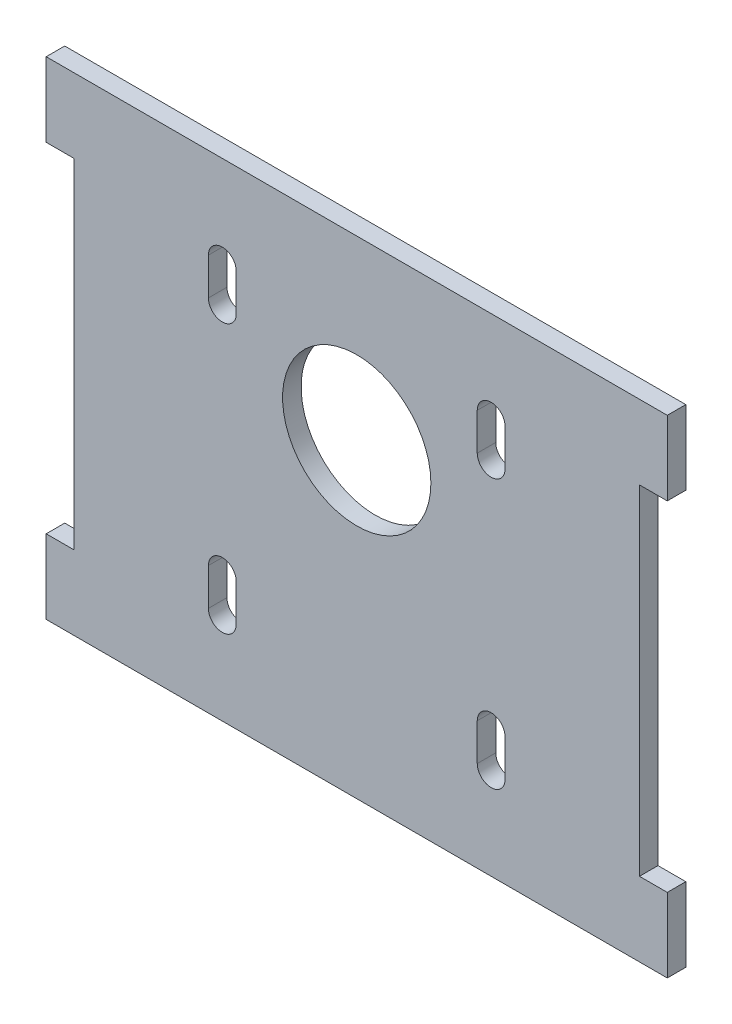
ISO-10303-21;
HEADER;
FILE_DESCRIPTION(('STEP AP214'),'2;1');
FILE_NAME('part.step','',(''),(''),'','','');
FILE_SCHEMA(('AUTOMOTIVE_DESIGN { 1 0 10303 214 1 1 1 1 }'));
ENDSEC;
DATA;
#1=APPLICATION_CONTEXT('core data for automotive mechanical design processes');
#2=APPLICATION_PROTOCOL_DEFINITION('international standard','automotive_design',2000,#1);
#3=PRODUCT_CONTEXT('',#1,'mechanical');
#4=PRODUCT('Part','Part','',(#3));
#5=PRODUCT_RELATED_PRODUCT_CATEGORY('part','',(#4));
#6=PRODUCT_DEFINITION_FORMATION('','',#4);
#7=PRODUCT_DEFINITION_CONTEXT('part definition',#1,'design');
#8=PRODUCT_DEFINITION('design','',#6,#7);
#9=PRODUCT_DEFINITION_SHAPE('','',#8);
#10=(LENGTH_UNIT() NAMED_UNIT(*) SI_UNIT(.MILLI.,.METRE.));
#11=(NAMED_UNIT(*) PLANE_ANGLE_UNIT() SI_UNIT($,.RADIAN.));
#12=(NAMED_UNIT(*) SI_UNIT($,.STERADIAN.) SOLID_ANGLE_UNIT());
#13=UNCERTAINTY_MEASURE_WITH_UNIT(LENGTH_MEASURE(1.E-05),#10,'distance_accuracy_value','');
#14=(GEOMETRIC_REPRESENTATION_CONTEXT(3) GLOBAL_UNCERTAINTY_ASSIGNED_CONTEXT((#13)) GLOBAL_UNIT_ASSIGNED_CONTEXT((#10,
#11,#12)) REPRESENTATION_CONTEXT('',''));
#15=CARTESIAN_POINT('',(0.,0.,0.));
#16=DIRECTION('',(0.,0.,1.));
#17=DIRECTION('',(1.,0.,0.));
#18=AXIS2_PLACEMENT_3D('',#15,#16,#17);
#19=CARTESIAN_POINT('',(106.3625,60.5945834611221,6.35));
#20=DIRECTION('',(-1.,0.,0.));
#21=DIRECTION('',(0.,-1.,0.));
#22=AXIS2_PLACEMENT_3D('',#19,#20,#21);
#23=PLANE('',#22);
#24=DIRECTION('',(0.,1.,0.));
#25=VECTOR('',#24,1.);
#26=CARTESIAN_POINT('',(106.3625,60.5945834611221,0.));
#27=LINE('',#26,#25);
#28=CARTESIAN_POINT('',(106.3625,-106.314583461122,0.));
#29=VERTEX_POINT('',#28);
#30=CARTESIAN_POINT('',(106.3625,-80.9145834611216,0.));
#31=VERTEX_POINT('',#30);
#32=EDGE_CURVE('E239',#29,#31,#27,.T.);
#33=ORIENTED_EDGE('',*,*,#32,.T.);
#34=DIRECTION('',(0.,0.,1.));
#35=VECTOR('',#34,1.);
#36=CARTESIAN_POINT('',(106.3625,-80.9145834611216,-0.00100000000000013));
#37=LINE('',#36,#35);
#38=CARTESIAN_POINT('',(106.3625,-80.9145834611216,6.35));
#39=VERTEX_POINT('',#38);
#40=EDGE_CURVE('E224',#31,#39,#37,.T.);
#41=ORIENTED_EDGE('',*,*,#40,.T.);
#42=DIRECTION('',(0.,1.,0.));
#43=VECTOR('',#42,1.);
#44=CARTESIAN_POINT('',(106.3625,60.5945834611221,6.35));
#45=LINE('',#44,#43);
#46=CARTESIAN_POINT('',(106.3625,-106.314583461122,6.35));
#47=VERTEX_POINT('',#46);
#48=EDGE_CURVE('E261',#47,#39,#45,.T.);
#49=ORIENTED_EDGE('',*,*,#48,.F.);
#50=DIRECTION('',(0.,0.,-1.));
#51=VECTOR('',#50,1.);
#52=CARTESIAN_POINT('',(106.3625,-106.314583461122,6.35));
#53=LINE('',#52,#51);
#54=EDGE_CURVE('E39',#47,#29,#53,.T.);
#55=ORIENTED_EDGE('',*,*,#54,.T.);
#56=EDGE_LOOP('',(#33,#41,#49,#55));
#57=FACE_BOUND('',#56,.T.);
#58=ADVANCED_FACE('F31',(#57),#23,.F.);
#59=CARTESIAN_POINT('',(-106.3625,60.5945834611221,6.35));
#60=DIRECTION('',(1.,0.,0.));
#61=DIRECTION('',(0.,1.,0.));
#62=AXIS2_PLACEMENT_3D('',#59,#60,#61);
#63=PLANE('',#62);
#64=DIRECTION('',(0.,-1.,0.));
#65=VECTOR('',#64,1.);
#66=CARTESIAN_POINT('',(-106.3625,60.5945834611221,0.));
#67=LINE('',#66,#65);
#68=CARTESIAN_POINT('',(-106.3625,60.5945834611221,0.));
#69=VERTEX_POINT('',#68);
#70=CARTESIAN_POINT('',(-106.3625,35.1945834611221,0.));
#71=VERTEX_POINT('',#70);
#72=EDGE_CURVE('E243',#69,#71,#67,.T.);
#73=ORIENTED_EDGE('',*,*,#72,.T.);
#74=DIRECTION('',(0.,0.,1.));
#75=VECTOR('',#74,1.);
#76=CARTESIAN_POINT('',(-106.3625,35.1945834611221,-0.00100000000000013));
#77=LINE('',#76,#75);
#78=CARTESIAN_POINT('',(-106.3625,35.1945834611221,6.35));
#79=VERTEX_POINT('',#78);
#80=EDGE_CURVE('E296',#71,#79,#77,.T.);
#81=ORIENTED_EDGE('',*,*,#80,.T.);
#82=DIRECTION('',(0.,-1.,0.));
#83=VECTOR('',#82,1.);
#84=CARTESIAN_POINT('',(-106.3625,60.5945834611221,6.35));
#85=LINE('',#84,#83);
#86=CARTESIAN_POINT('',(-106.3625,60.5945834611221,6.35));
#87=VERTEX_POINT('',#86);
#88=EDGE_CURVE('E437',#87,#79,#85,.T.);
#89=ORIENTED_EDGE('',*,*,#88,.F.);
#90=DIRECTION('',(0.,0.,-1.));
#91=VECTOR('',#90,1.);
#92=CARTESIAN_POINT('',(-106.3625,60.5945834611221,6.35));
#93=LINE('',#92,#91);
#94=EDGE_CURVE('E249',#87,#69,#93,.T.);
#95=ORIENTED_EDGE('',*,*,#94,.T.);
#96=EDGE_LOOP('',(#73,#81,#89,#95));
#97=FACE_BOUND('',#96,.T.);
#98=ADVANCED_FACE('F464',(#97),#63,.F.);
#99=CARTESIAN_POINT('',(-106.3625,-80.9145834611216,6.35));
#100=VERTEX_POINT('',#99);
#101=CARTESIAN_POINT('',(-106.3625,-106.314583461122,6.35));
#102=VERTEX_POINT('',#101);
#103=EDGE_CURVE('E248',#100,#102,#85,.T.);
#104=ORIENTED_EDGE('',*,*,#103,.F.);
#105=DIRECTION('',(0.,0.,1.));
#106=VECTOR('',#105,1.);
#107=CARTESIAN_POINT('',(-106.3625,-80.9145834611216,-0.00100000000000013));
#108=LINE('',#107,#106);
#109=CARTESIAN_POINT('',(-106.3625,-80.9145834611216,0.));
#110=VERTEX_POINT('',#109);
#111=EDGE_CURVE('E295',#110,#100,#108,.T.);
#112=ORIENTED_EDGE('',*,*,#111,.F.);
#113=CARTESIAN_POINT('',(-106.3625,-106.314583461122,0.));
#114=VERTEX_POINT('',#113);
#115=EDGE_CURVE('E436',#110,#114,#67,.T.);
#116=ORIENTED_EDGE('',*,*,#115,.T.);
#117=DIRECTION('',(0.,0.,-1.));
#118=VECTOR('',#117,1.);
#119=CARTESIAN_POINT('',(-106.3625,-106.314583461122,6.35));
#120=LINE('',#119,#118);
#121=EDGE_CURVE('E11',#102,#114,#120,.T.);
#122=ORIENTED_EDGE('',*,*,#121,.F.);
#123=EDGE_LOOP('',(#104,#112,#116,#122));
#124=FACE_BOUND('',#123,.T.);
#125=ADVANCED_FACE('F33',(#124),#63,.F.);
#126=CARTESIAN_POINT('',(-106.3625,-106.314583461122,6.35));
#127=DIRECTION('',(0.,1.,0.));
#128=DIRECTION('',(0.,0.,1.));
#129=AXIS2_PLACEMENT_3D('',#126,#127,#128);
#130=PLANE('',#129);
#131=DIRECTION('',(1.,0.,0.));
#132=VECTOR('',#131,1.);
#133=CARTESIAN_POINT('',(-106.3625,-106.314583461122,0.));
#134=LINE('',#133,#132);
#135=EDGE_CURVE('E240',#114,#29,#134,.T.);
#136=ORIENTED_EDGE('',*,*,#135,.T.);
#137=ORIENTED_EDGE('',*,*,#54,.F.);
#138=DIRECTION('',(1.,0.,0.));
#139=VECTOR('',#138,1.);
#140=CARTESIAN_POINT('',(-106.3625,-106.314583461122,6.35));
#141=LINE('',#140,#139);
#142=EDGE_CURVE('E440',#102,#47,#141,.T.);
#143=ORIENTED_EDGE('',*,*,#142,.F.);
#144=ORIENTED_EDGE('',*,*,#121,.T.);
#145=EDGE_LOOP('',(#136,#137,#143,#144));
#146=FACE_BOUND('',#145,.T.);
#147=ADVANCED_FACE('F472',(#146),#130,.F.);
#148=CARTESIAN_POINT('',(106.3625,35.1945834611221,6.35));
#149=VERTEX_POINT('',#148);
#150=CARTESIAN_POINT('',(106.3625,60.5945834611221,6.35));
#151=VERTEX_POINT('',#150);
#152=EDGE_CURVE('E232',#149,#151,#45,.T.);
#153=ORIENTED_EDGE('',*,*,#152,.F.);
#154=DIRECTION('',(0.,0.,1.));
#155=VECTOR('',#154,1.);
#156=CARTESIAN_POINT('',(106.3625,35.1945834611221,-0.00100000000000013));
#157=LINE('',#156,#155);
#158=CARTESIAN_POINT('',(106.3625,35.1945834611221,0.));
#159=VERTEX_POINT('',#158);
#160=EDGE_CURVE('E219',#159,#149,#157,.T.);
#161=ORIENTED_EDGE('',*,*,#160,.F.);
#162=CARTESIAN_POINT('',(106.3625,60.5945834611221,0.));
#163=VERTEX_POINT('',#162);
#164=EDGE_CURVE('E230',#159,#163,#27,.T.);
#165=ORIENTED_EDGE('',*,*,#164,.T.);
#166=DIRECTION('',(0.,0.,-1.));
#167=VECTOR('',#166,1.);
#168=CARTESIAN_POINT('',(106.3625,60.5945834611221,6.35));
#169=LINE('',#168,#167);
#170=EDGE_CURVE('E252',#151,#163,#169,.T.);
#171=ORIENTED_EDGE('',*,*,#170,.F.);
#172=EDGE_LOOP('',(#153,#161,#165,#171));
#173=FACE_BOUND('',#172,.T.);
#174=ADVANCED_FACE('F228',(#173),#23,.F.);
#175=CARTESIAN_POINT('',(-106.3625,60.5945834611221,6.35));
#176=DIRECTION('',(0.,-1.,0.));
#177=DIRECTION('',(0.,0.,-1.));
#178=AXIS2_PLACEMENT_3D('',#175,#176,#177);
#179=PLANE('',#178);
#180=DIRECTION('',(-1.,0.,0.));
#181=VECTOR('',#180,1.);
#182=CARTESIAN_POINT('',(-106.3625,60.5945834611221,0.));
#183=LINE('',#182,#181);
#184=EDGE_CURVE('E238',#163,#69,#183,.T.);
#185=ORIENTED_EDGE('',*,*,#184,.T.);
#186=ORIENTED_EDGE('',*,*,#94,.F.);
#187=DIRECTION('',(-1.,0.,0.));
#188=VECTOR('',#187,1.);
#189=CARTESIAN_POINT('',(-106.3625,60.5945834611221,6.35));
#190=LINE('',#189,#188);
#191=EDGE_CURVE('E253',#151,#87,#190,.T.);
#192=ORIENTED_EDGE('',*,*,#191,.F.);
#193=ORIENTED_EDGE('',*,*,#170,.T.);
#194=EDGE_LOOP('',(#185,#186,#192,#193));
#195=FACE_BOUND('',#194,.T.);
#196=ADVANCED_FACE('F468',(#195),#179,.F.);
#197=CARTESIAN_POINT('',(-106.3625,-106.314583461122,6.35));
#198=DIRECTION('',(0.,0.,1.));
#199=DIRECTION('',(1.,0.,0.));
#200=AXIS2_PLACEMENT_3D('',#197,#198,#199);
#201=PLANE('',#200);
#202=DIRECTION('',(1.,0.,0.));
#203=VECTOR('',#202,1.);
#204=CARTESIAN_POINT('',(106.3625,-80.9145834611216,6.35));
#205=LINE('',#204,#203);
#206=CARTESIAN_POINT('',(96.8375,-80.9145834611216,6.35));
#207=VERTEX_POINT('',#206);
#208=EDGE_CURVE('E233',#207,#39,#205,.T.);
#209=ORIENTED_EDGE('',*,*,#208,.F.);
#210=DIRECTION('',(0.,-1.,0.));
#211=VECTOR('',#210,1.);
#212=CARTESIAN_POINT('',(96.8375,-80.9145834611216,6.35));
#213=LINE('',#212,#211);
#214=CARTESIAN_POINT('',(96.8375,35.1945834611221,6.35));
#215=VERTEX_POINT('',#214);
#216=EDGE_CURVE('E272',#215,#207,#213,.T.);
#217=ORIENTED_EDGE('',*,*,#216,.F.);
#218=DIRECTION('',(-1.,0.,0.));
#219=VECTOR('',#218,1.);
#220=CARTESIAN_POINT('',(106.3625,35.1945834611221,6.35));
#221=LINE('',#220,#219);
#222=EDGE_CURVE('E270',#149,#215,#221,.T.);
#223=ORIENTED_EDGE('',*,*,#222,.F.);
#224=ORIENTED_EDGE('',*,*,#152,.T.);
#225=ORIENTED_EDGE('',*,*,#191,.T.);
#226=ORIENTED_EDGE('',*,*,#88,.T.);
#227=DIRECTION('',(-1.,0.,0.));
#228=VECTOR('',#227,1.);
#229=CARTESIAN_POINT('',(-106.3625,35.1945834611221,6.35));
#230=LINE('',#229,#228);
#231=CARTESIAN_POINT('',(-96.8375,35.1945834611221,6.35));
#232=VERTEX_POINT('',#231);
#233=EDGE_CURVE('E293',#232,#79,#230,.T.);
#234=ORIENTED_EDGE('',*,*,#233,.F.);
#235=DIRECTION('',(0.,1.,0.));
#236=VECTOR('',#235,1.);
#237=CARTESIAN_POINT('',(-96.8375,-80.9145834611216,6.35));
#238=LINE('',#237,#236);
#239=CARTESIAN_POINT('',(-96.8375,-80.9145834611216,6.35));
#240=VERTEX_POINT('',#239);
#241=EDGE_CURVE('E290',#240,#232,#238,.T.);
#242=ORIENTED_EDGE('',*,*,#241,.F.);
#243=DIRECTION('',(1.,0.,0.));
#244=VECTOR('',#243,1.);
#245=CARTESIAN_POINT('',(-106.3625,-80.9145834611216,6.35));
#246=LINE('',#245,#244);
#247=EDGE_CURVE('E287',#100,#240,#246,.T.);
#248=ORIENTED_EDGE('',*,*,#247,.F.);
#249=ORIENTED_EDGE('',*,*,#103,.T.);
#250=ORIENTED_EDGE('',*,*,#142,.T.);
#251=ORIENTED_EDGE('',*,*,#48,.T.);
#252=EDGE_LOOP('',(#209,#217,#223,#224,#225,#226,#234,#242,#248,#249,#250,#251));
#253=FACE_BOUND('',#252,.T.);
#254=CARTESIAN_POINT('',(0.,0.,6.35));
#255=DIRECTION('',(0.,0.,1.));
#256=DIRECTION('',(1.,0.,0.));
#257=AXIS2_PLACEMENT_3D('',#254,#255,#256);
#258=CIRCLE('',#257,25.4);
#259=CARTESIAN_POINT('',(25.4,0.,6.35));
#260=VERTEX_POINT('',#259);
#261=EDGE_CURVE('E306',#260,#260,#258,.T.);
#262=ORIENTED_EDGE('',*,*,#261,.F.);
#263=EDGE_LOOP('',(#262));
#264=FACE_BOUND('',#263,.T.);
#265=CARTESIAN_POINT('',(-46.0375,-75.2475,6.35));
#266=DIRECTION('',(0.,0.,1.));
#267=DIRECTION('',(-1.,0.,0.));
#268=AXIS2_PLACEMENT_3D('',#265,#266,#267);
#269=CIRCLE('',#268,4.7625);
#270=CARTESIAN_POINT('',(-50.8,-75.2475,6.35));
#271=VERTEX_POINT('',#270);
#272=CARTESIAN_POINT('',(-41.275,-75.2475,6.35));
#273=VERTEX_POINT('',#272);
#274=EDGE_CURVE('E320',#271,#273,#269,.T.);
#275=ORIENTED_EDGE('',*,*,#274,.F.);
#276=DIRECTION('',(0.,-1.,0.));
#277=VECTOR('',#276,1.);
#278=CARTESIAN_POINT('',(-50.8,-75.2475,6.35));
#279=LINE('',#278,#277);
#280=CARTESIAN_POINT('',(-50.8,-62.5475,6.35));
#281=VERTEX_POINT('',#280);
#282=EDGE_CURVE('E328',#281,#271,#279,.T.);
#283=ORIENTED_EDGE('',*,*,#282,.F.);
#284=CARTESIAN_POINT('',(-46.0375,-62.5475,6.35));
#285=DIRECTION('',(0.,0.,1.));
#286=DIRECTION('',(-1.,0.,0.));
#287=AXIS2_PLACEMENT_3D('',#284,#285,#286);
#288=CIRCLE('',#287,4.7625);
#289=CARTESIAN_POINT('',(-41.275,-62.5475,6.35));
#290=VERTEX_POINT('',#289);
#291=EDGE_CURVE('E325',#290,#281,#288,.T.);
#292=ORIENTED_EDGE('',*,*,#291,.F.);
#293=DIRECTION('',(0.,1.,0.));
#294=VECTOR('',#293,1.);
#295=CARTESIAN_POINT('',(-41.275,-75.2475,6.35));
#296=LINE('',#295,#294);
#297=EDGE_CURVE('E322',#273,#290,#296,.T.);
#298=ORIENTED_EDGE('',*,*,#297,.F.);
#299=EDGE_LOOP('',(#275,#283,#292,#298));
#300=FACE_BOUND('',#299,.T.);
#301=CARTESIAN_POINT('',(-46.0375,16.8275,6.35));
#302=DIRECTION('',(0.,0.,1.));
#303=DIRECTION('',(-1.,0.,0.));
#304=AXIS2_PLACEMENT_3D('',#301,#302,#303);
#305=CIRCLE('',#304,4.7625);
#306=CARTESIAN_POINT('',(-50.8,16.8275,6.35));
#307=VERTEX_POINT('',#306);
#308=CARTESIAN_POINT('',(-41.275,16.8275,6.35));
#309=VERTEX_POINT('',#308);
#310=EDGE_CURVE('E351',#307,#309,#305,.T.);
#311=ORIENTED_EDGE('',*,*,#310,.F.);
#312=DIRECTION('',(0.,-1.,0.));
#313=VECTOR('',#312,1.);
#314=CARTESIAN_POINT('',(-50.8,16.8275,6.35));
#315=LINE('',#314,#313);
#316=CARTESIAN_POINT('',(-50.8,29.5275,6.35));
#317=VERTEX_POINT('',#316);
#318=EDGE_CURVE('E359',#317,#307,#315,.T.);
#319=ORIENTED_EDGE('',*,*,#318,.F.);
#320=CARTESIAN_POINT('',(-46.0375,29.5275,6.35));
#321=DIRECTION('',(0.,0.,1.));
#322=DIRECTION('',(-1.,0.,0.));
#323=AXIS2_PLACEMENT_3D('',#320,#321,#322);
#324=CIRCLE('',#323,4.7625);
#325=CARTESIAN_POINT('',(-41.275,29.5275,6.35));
#326=VERTEX_POINT('',#325);
#327=EDGE_CURVE('E356',#326,#317,#324,.T.);
#328=ORIENTED_EDGE('',*,*,#327,.F.);
#329=DIRECTION('',(0.,1.,0.));
#330=VECTOR('',#329,1.);
#331=CARTESIAN_POINT('',(-41.275,16.8275,6.35));
#332=LINE('',#331,#330);
#333=EDGE_CURVE('E353',#309,#326,#332,.T.);
#334=ORIENTED_EDGE('',*,*,#333,.F.);
#335=EDGE_LOOP('',(#311,#319,#328,#334));
#336=FACE_BOUND('',#335,.T.);
#337=CARTESIAN_POINT('',(46.0375,16.8275,6.35));
#338=DIRECTION('',(0.,0.,1.));
#339=DIRECTION('',(-1.,0.,0.));
#340=AXIS2_PLACEMENT_3D('',#337,#338,#339);
#341=CIRCLE('',#340,4.7625);
#342=CARTESIAN_POINT('',(41.275,16.8275,6.35));
#343=VERTEX_POINT('',#342);
#344=CARTESIAN_POINT('',(50.8,16.8275,6.35));
#345=VERTEX_POINT('',#344);
#346=EDGE_CURVE('E382',#343,#345,#341,.T.);
#347=ORIENTED_EDGE('',*,*,#346,.F.);
#348=DIRECTION('',(0.,-1.,0.));
#349=VECTOR('',#348,1.);
#350=CARTESIAN_POINT('',(41.275,16.8275,6.35));
#351=LINE('',#350,#349);
#352=CARTESIAN_POINT('',(41.275,29.5275,6.35));
#353=VERTEX_POINT('',#352);
#354=EDGE_CURVE('E390',#353,#343,#351,.T.);
#355=ORIENTED_EDGE('',*,*,#354,.F.);
#356=CARTESIAN_POINT('',(46.0375,29.5275,6.35));
#357=DIRECTION('',(0.,0.,1.));
#358=DIRECTION('',(-1.,0.,0.));
#359=AXIS2_PLACEMENT_3D('',#356,#357,#358);
#360=CIRCLE('',#359,4.7625);
#361=CARTESIAN_POINT('',(50.8,29.5275,6.35));
#362=VERTEX_POINT('',#361);
#363=EDGE_CURVE('E387',#362,#353,#360,.T.);
#364=ORIENTED_EDGE('',*,*,#363,.F.);
#365=DIRECTION('',(0.,1.,0.));
#366=VECTOR('',#365,1.);
#367=CARTESIAN_POINT('',(50.8,16.8275,6.35));
#368=LINE('',#367,#366);
#369=EDGE_CURVE('E384',#345,#362,#368,.T.);
#370=ORIENTED_EDGE('',*,*,#369,.F.);
#371=EDGE_LOOP('',(#347,#355,#364,#370));
#372=FACE_BOUND('',#371,.T.);
#373=CARTESIAN_POINT('',(46.0375,-75.2475,6.35));
#374=DIRECTION('',(0.,0.,1.));
#375=DIRECTION('',(-1.,0.,0.));
#376=AXIS2_PLACEMENT_3D('',#373,#374,#375);
#377=CIRCLE('',#376,4.7625);
#378=CARTESIAN_POINT('',(41.275,-75.2475,6.35));
#379=VERTEX_POINT('',#378);
#380=CARTESIAN_POINT('',(50.8,-75.2475,6.35));
#381=VERTEX_POINT('',#380);
#382=EDGE_CURVE('E413',#379,#381,#377,.T.);
#383=ORIENTED_EDGE('',*,*,#382,.F.);
#384=DIRECTION('',(0.,-1.,0.));
#385=VECTOR('',#384,1.);
#386=CARTESIAN_POINT('',(41.275,-75.2475,6.35));
#387=LINE('',#386,#385);
#388=CARTESIAN_POINT('',(41.275,-62.5475,6.35));
#389=VERTEX_POINT('',#388);
#390=EDGE_CURVE('E421',#389,#379,#387,.T.);
#391=ORIENTED_EDGE('',*,*,#390,.F.);
#392=CARTESIAN_POINT('',(46.0375,-62.5475,6.35));
#393=DIRECTION('',(0.,0.,1.));
#394=DIRECTION('',(-1.,0.,0.));
#395=AXIS2_PLACEMENT_3D('',#392,#393,#394);
#396=CIRCLE('',#395,4.7625);
#397=CARTESIAN_POINT('',(50.8,-62.5475,6.35));
#398=VERTEX_POINT('',#397);
#399=EDGE_CURVE('E418',#398,#389,#396,.T.);
#400=ORIENTED_EDGE('',*,*,#399,.F.);
#401=DIRECTION('',(0.,1.,0.));
#402=VECTOR('',#401,1.);
#403=CARTESIAN_POINT('',(50.8,-75.2475,6.35));
#404=LINE('',#403,#402);
#405=EDGE_CURVE('E415',#381,#398,#404,.T.);
#406=ORIENTED_EDGE('',*,*,#405,.F.);
#407=EDGE_LOOP('',(#383,#391,#400,#406));
#408=FACE_BOUND('',#407,.T.);
#409=ADVANCED_FACE('F459',(#253,#264,#300,#336,#372,#408),#201,.T.);
#410=CARTESIAN_POINT('',(-106.3625,-106.314583461122,0.));
#411=DIRECTION('',(0.,0.,1.));
#412=DIRECTION('',(1.,0.,0.));
#413=AXIS2_PLACEMENT_3D('',#410,#411,#412);
#414=PLANE('',#413);
#415=CARTESIAN_POINT('',(0.,0.,0.));
#416=DIRECTION('',(0.,0.,1.));
#417=DIRECTION('',(1.,0.,0.));
#418=AXIS2_PLACEMENT_3D('',#415,#416,#417);
#419=CIRCLE('',#418,25.4);
#420=CARTESIAN_POINT('',(25.4,0.,0.));
#421=VERTEX_POINT('',#420);
#422=EDGE_CURVE('E309',#421,#421,#419,.F.);
#423=ORIENTED_EDGE('',*,*,#422,.F.);
#424=EDGE_LOOP('',(#423));
#425=FACE_BOUND('',#424,.T.);
#426=DIRECTION('',(0.,1.,0.));
#427=VECTOR('',#426,1.);
#428=CARTESIAN_POINT('',(-50.8,-75.2475,0.));
#429=LINE('',#428,#427);
#430=CARTESIAN_POINT('',(-50.8,-75.2475,0.));
#431=VERTEX_POINT('',#430);
#432=CARTESIAN_POINT('',(-50.8,-62.5475,0.));
#433=VERTEX_POINT('',#432);
#434=EDGE_CURVE('E314',#431,#433,#429,.T.);
#435=ORIENTED_EDGE('',*,*,#434,.F.);
#436=CARTESIAN_POINT('',(-46.0375,-75.2475,0.));
#437=DIRECTION('',(0.,0.,1.));
#438=DIRECTION('',(1.,0.,0.));
#439=AXIS2_PLACEMENT_3D('',#436,#437,#438);
#440=CIRCLE('',#439,4.7625);
#441=CARTESIAN_POINT('',(-41.275,-75.2475,0.));
#442=VERTEX_POINT('',#441);
#443=EDGE_CURVE('E317',#442,#431,#440,.F.);
#444=ORIENTED_EDGE('',*,*,#443,.F.);
#445=DIRECTION('',(0.,-1.,0.));
#446=VECTOR('',#445,1.);
#447=CARTESIAN_POINT('',(-41.275,-75.2475,0.));
#448=LINE('',#447,#446);
#449=CARTESIAN_POINT('',(-41.275,-62.5475,0.));
#450=VERTEX_POINT('',#449);
#451=EDGE_CURVE('E334',#450,#442,#448,.T.);
#452=ORIENTED_EDGE('',*,*,#451,.F.);
#453=CARTESIAN_POINT('',(-46.0375,-62.5475,0.));
#454=DIRECTION('',(0.,0.,1.));
#455=DIRECTION('',(1.,0.,0.));
#456=AXIS2_PLACEMENT_3D('',#453,#454,#455);
#457=CIRCLE('',#456,4.7625);
#458=EDGE_CURVE('E312',#433,#450,#457,.F.);
#459=ORIENTED_EDGE('',*,*,#458,.F.);
#460=EDGE_LOOP('',(#435,#444,#452,#459));
#461=FACE_BOUND('',#460,.T.);
#462=DIRECTION('',(0.,1.,0.));
#463=VECTOR('',#462,1.);
#464=CARTESIAN_POINT('',(-50.8,16.8275,0.));
#465=LINE('',#464,#463);
#466=CARTESIAN_POINT('',(-50.8,16.8275,0.));
#467=VERTEX_POINT('',#466);
#468=CARTESIAN_POINT('',(-50.8,29.5275,0.));
#469=VERTEX_POINT('',#468);
#470=EDGE_CURVE('E345',#467,#469,#465,.T.);
#471=ORIENTED_EDGE('',*,*,#470,.F.);
#472=CARTESIAN_POINT('',(-46.0375,16.8275,0.));
#473=DIRECTION('',(0.,0.,1.));
#474=DIRECTION('',(1.,0.,0.));
#475=AXIS2_PLACEMENT_3D('',#472,#473,#474);
#476=CIRCLE('',#475,4.7625);
#477=CARTESIAN_POINT('',(-41.275,16.8275,0.));
#478=VERTEX_POINT('',#477);
#479=EDGE_CURVE('E348',#478,#467,#476,.F.);
#480=ORIENTED_EDGE('',*,*,#479,.F.);
#481=DIRECTION('',(0.,-1.,0.));
#482=VECTOR('',#481,1.);
#483=CARTESIAN_POINT('',(-41.275,16.8275,0.));
#484=LINE('',#483,#482);
#485=CARTESIAN_POINT('',(-41.275,29.5275,0.));
#486=VERTEX_POINT('',#485);
#487=EDGE_CURVE('E365',#486,#478,#484,.T.);
#488=ORIENTED_EDGE('',*,*,#487,.F.);
#489=CARTESIAN_POINT('',(-46.0375,29.5275,0.));
#490=DIRECTION('',(0.,0.,1.));
#491=DIRECTION('',(1.,0.,0.));
#492=AXIS2_PLACEMENT_3D('',#489,#490,#491);
#493=CIRCLE('',#492,4.7625);
#494=EDGE_CURVE('E343',#469,#486,#493,.F.);
#495=ORIENTED_EDGE('',*,*,#494,.F.);
#496=EDGE_LOOP('',(#471,#480,#488,#495));
#497=FACE_BOUND('',#496,.T.);
#498=DIRECTION('',(0.,1.,0.));
#499=VECTOR('',#498,1.);
#500=CARTESIAN_POINT('',(41.275,16.8275,0.));
#501=LINE('',#500,#499);
#502=CARTESIAN_POINT('',(41.275,16.8275,0.));
#503=VERTEX_POINT('',#502);
#504=CARTESIAN_POINT('',(41.275,29.5275,0.));
#505=VERTEX_POINT('',#504);
#506=EDGE_CURVE('E376',#503,#505,#501,.T.);
#507=ORIENTED_EDGE('',*,*,#506,.F.);
#508=CARTESIAN_POINT('',(46.0375,16.8275,0.));
#509=DIRECTION('',(0.,0.,1.));
#510=DIRECTION('',(1.,0.,0.));
#511=AXIS2_PLACEMENT_3D('',#508,#509,#510);
#512=CIRCLE('',#511,4.7625);
#513=CARTESIAN_POINT('',(50.8,16.8275,0.));
#514=VERTEX_POINT('',#513);
#515=EDGE_CURVE('E379',#514,#503,#512,.F.);
#516=ORIENTED_EDGE('',*,*,#515,.F.);
#517=DIRECTION('',(0.,-1.,0.));
#518=VECTOR('',#517,1.);
#519=CARTESIAN_POINT('',(50.8,16.8275,0.));
#520=LINE('',#519,#518);
#521=CARTESIAN_POINT('',(50.8,29.5275,0.));
#522=VERTEX_POINT('',#521);
#523=EDGE_CURVE('E396',#522,#514,#520,.T.);
#524=ORIENTED_EDGE('',*,*,#523,.F.);
#525=CARTESIAN_POINT('',(46.0375,29.5275,0.));
#526=DIRECTION('',(0.,0.,1.));
#527=DIRECTION('',(1.,0.,0.));
#528=AXIS2_PLACEMENT_3D('',#525,#526,#527);
#529=CIRCLE('',#528,4.7625);
#530=EDGE_CURVE('E374',#505,#522,#529,.F.);
#531=ORIENTED_EDGE('',*,*,#530,.F.);
#532=EDGE_LOOP('',(#507,#516,#524,#531));
#533=FACE_BOUND('',#532,.T.);
#534=DIRECTION('',(0.,1.,0.));
#535=VECTOR('',#534,1.);
#536=CARTESIAN_POINT('',(41.275,-75.2475,0.));
#537=LINE('',#536,#535);
#538=CARTESIAN_POINT('',(41.275,-75.2475,0.));
#539=VERTEX_POINT('',#538);
#540=CARTESIAN_POINT('',(41.275,-62.5475,0.));
#541=VERTEX_POINT('',#540);
#542=EDGE_CURVE('E407',#539,#541,#537,.T.);
#543=ORIENTED_EDGE('',*,*,#542,.F.);
#544=CARTESIAN_POINT('',(46.0375,-75.2475,0.));
#545=DIRECTION('',(0.,0.,1.));
#546=DIRECTION('',(1.,0.,0.));
#547=AXIS2_PLACEMENT_3D('',#544,#545,#546);
#548=CIRCLE('',#547,4.7625);
#549=CARTESIAN_POINT('',(50.8,-75.2475,0.));
#550=VERTEX_POINT('',#549);
#551=EDGE_CURVE('E410',#550,#539,#548,.F.);
#552=ORIENTED_EDGE('',*,*,#551,.F.);
#553=DIRECTION('',(0.,-1.,0.));
#554=VECTOR('',#553,1.);
#555=CARTESIAN_POINT('',(50.8,-75.2475,0.));
#556=LINE('',#555,#554);
#557=CARTESIAN_POINT('',(50.8,-62.5475,0.));
#558=VERTEX_POINT('',#557);
#559=EDGE_CURVE('E427',#558,#550,#556,.T.);
#560=ORIENTED_EDGE('',*,*,#559,.F.);
#561=CARTESIAN_POINT('',(46.0375,-62.5475,0.));
#562=DIRECTION('',(0.,0.,1.));
#563=DIRECTION('',(1.,0.,0.));
#564=AXIS2_PLACEMENT_3D('',#561,#562,#563);
#565=CIRCLE('',#564,4.7625);
#566=EDGE_CURVE('E405',#541,#558,#565,.F.);
#567=ORIENTED_EDGE('',*,*,#566,.F.);
#568=EDGE_LOOP('',(#543,#552,#560,#567));
#569=FACE_BOUND('',#568,.T.);
#570=DIRECTION('',(0.,1.,0.));
#571=VECTOR('',#570,1.);
#572=CARTESIAN_POINT('',(96.8375,-80.9145834611216,0.));
#573=LINE('',#572,#571);
#574=CARTESIAN_POINT('',(96.8375,-80.9145834611216,0.));
#575=VERTEX_POINT('',#574);
#576=CARTESIAN_POINT('',(96.8375,35.1945834611221,0.));
#577=VERTEX_POINT('',#576);
#578=EDGE_CURVE('E46',#575,#577,#573,.T.);
#579=ORIENTED_EDGE('',*,*,#578,.F.);
#580=DIRECTION('',(-1.,0.,0.));
#581=VECTOR('',#580,1.);
#582=CARTESIAN_POINT('',(106.3625,-80.9145834611216,0.));
#583=LINE('',#582,#581);
#584=EDGE_CURVE('E268',#31,#575,#583,.T.);
#585=ORIENTED_EDGE('',*,*,#584,.F.);
#586=ORIENTED_EDGE('',*,*,#32,.F.);
#587=ORIENTED_EDGE('',*,*,#135,.F.);
#588=ORIENTED_EDGE('',*,*,#115,.F.);
#589=DIRECTION('',(-1.,0.,0.));
#590=VECTOR('',#589,1.);
#591=CARTESIAN_POINT('',(-106.3625,-80.9145834611216,0.));
#592=LINE('',#591,#590);
#593=CARTESIAN_POINT('',(-96.8375,-80.9145834611216,0.));
#594=VERTEX_POINT('',#593);
#595=EDGE_CURVE('E299',#594,#110,#592,.T.);
#596=ORIENTED_EDGE('',*,*,#595,.F.);
#597=DIRECTION('',(0.,-1.,0.));
#598=VECTOR('',#597,1.);
#599=CARTESIAN_POINT('',(-96.8375,-80.9145834611216,0.));
#600=LINE('',#599,#598);
#601=CARTESIAN_POINT('',(-96.8375,35.1945834611221,0.));
#602=VERTEX_POINT('',#601);
#603=EDGE_CURVE('E54',#602,#594,#600,.T.);
#604=ORIENTED_EDGE('',*,*,#603,.F.);
#605=DIRECTION('',(1.,0.,0.));
#606=VECTOR('',#605,1.);
#607=CARTESIAN_POINT('',(-106.3625,35.1945834611221,0.));
#608=LINE('',#607,#606);
#609=EDGE_CURVE('E284',#71,#602,#608,.T.);
#610=ORIENTED_EDGE('',*,*,#609,.F.);
#611=ORIENTED_EDGE('',*,*,#72,.F.);
#612=ORIENTED_EDGE('',*,*,#184,.F.);
#613=ORIENTED_EDGE('',*,*,#164,.F.);
#614=DIRECTION('',(1.,0.,0.));
#615=VECTOR('',#614,1.);
#616=CARTESIAN_POINT('',(106.3625,35.1945834611221,0.));
#617=LINE('',#616,#615);
#618=EDGE_CURVE('E215',#577,#159,#617,.T.);
#619=ORIENTED_EDGE('',*,*,#618,.F.);
#620=EDGE_LOOP('',(#579,#585,#586,#587,#588,#596,#604,#610,#611,#612,#613,#619));
#621=FACE_BOUND('',#620,.T.);
#622=ADVANCED_FACE('F236',(#425,#461,#497,#533,#569,#621),#414,.F.);
#623=CARTESIAN_POINT('',(46.0375,-75.2475,-0.00100000000000013));
#624=DIRECTION('',(0.,0.,1.));
#625=DIRECTION('',(1.,0.,0.));
#626=AXIS2_PLACEMENT_3D('',#623,#624,#625);
#627=CYLINDRICAL_SURFACE('',#626,4.7625);
#628=ORIENTED_EDGE('',*,*,#551,.T.);
#629=DIRECTION('',(0.,0.,1.));
#630=VECTOR('',#629,1.);
#631=CARTESIAN_POINT('',(41.275,-75.2475,-0.00100000000000013));
#632=LINE('',#631,#630);
#633=EDGE_CURVE('E425',#539,#379,#632,.T.);
#634=ORIENTED_EDGE('',*,*,#633,.T.);
#635=ORIENTED_EDGE('',*,*,#382,.T.);
#636=DIRECTION('',(0.,0.,1.));
#637=VECTOR('',#636,1.);
#638=CARTESIAN_POINT('',(50.8,-75.2475,-0.00100000000000013));
#639=LINE('',#638,#637);
#640=EDGE_CURVE('E424',#550,#381,#639,.T.);
#641=ORIENTED_EDGE('',*,*,#640,.F.);
#642=EDGE_LOOP('',(#628,#634,#635,#641));
#643=FACE_BOUND('',#642,.T.);
#644=ADVANCED_FACE('F488',(#643),#627,.F.);
#645=CARTESIAN_POINT('',(41.275,-75.2475,-0.00100000000000013));
#646=DIRECTION('',(-1.,0.,0.));
#647=DIRECTION('',(0.,0.,1.));
#648=AXIS2_PLACEMENT_3D('',#645,#646,#647);
#649=PLANE('',#648);
#650=ORIENTED_EDGE('',*,*,#542,.T.);
#651=DIRECTION('',(0.,0.,1.));
#652=VECTOR('',#651,1.);
#653=CARTESIAN_POINT('',(41.275,-62.5475,-0.00100000000000013));
#654=LINE('',#653,#652);
#655=EDGE_CURVE('E428',#541,#389,#654,.T.);
#656=ORIENTED_EDGE('',*,*,#655,.T.);
#657=ORIENTED_EDGE('',*,*,#390,.T.);
#658=ORIENTED_EDGE('',*,*,#633,.F.);
#659=EDGE_LOOP('',(#650,#656,#657,#658));
#660=FACE_BOUND('',#659,.T.);
#661=ADVANCED_FACE('F494',(#660),#649,.F.);
#662=CARTESIAN_POINT('',(46.0375,-62.5475,-0.00100000000000013));
#663=DIRECTION('',(0.,0.,1.));
#664=DIRECTION('',(1.,0.,0.));
#665=AXIS2_PLACEMENT_3D('',#662,#663,#664);
#666=CYLINDRICAL_SURFACE('',#665,4.7625);
#667=ORIENTED_EDGE('',*,*,#566,.T.);
#668=DIRECTION('',(0.,0.,1.));
#669=VECTOR('',#668,1.);
#670=CARTESIAN_POINT('',(50.8,-62.5475,-0.00100000000000013));
#671=LINE('',#670,#669);
#672=EDGE_CURVE('E430',#558,#398,#671,.T.);
#673=ORIENTED_EDGE('',*,*,#672,.T.);
#674=ORIENTED_EDGE('',*,*,#399,.T.);
#675=ORIENTED_EDGE('',*,*,#655,.F.);
#676=EDGE_LOOP('',(#667,#673,#674,#675));
#677=FACE_BOUND('',#676,.T.);
#678=ADVANCED_FACE('F500',(#677),#666,.F.);
#679=CARTESIAN_POINT('',(50.8,-75.2475,-0.00100000000000013));
#680=DIRECTION('',(1.,0.,0.));
#681=DIRECTION('',(0.,0.,-1.));
#682=AXIS2_PLACEMENT_3D('',#679,#680,#681);
#683=PLANE('',#682);
#684=ORIENTED_EDGE('',*,*,#559,.T.);
#685=ORIENTED_EDGE('',*,*,#640,.T.);
#686=ORIENTED_EDGE('',*,*,#405,.T.);
#687=ORIENTED_EDGE('',*,*,#672,.F.);
#688=EDGE_LOOP('',(#684,#685,#686,#687));
#689=FACE_BOUND('',#688,.T.);
#690=ADVANCED_FACE('F496',(#689),#683,.F.);
#691=CARTESIAN_POINT('',(46.0375,16.8275,-0.00100000000000013));
#692=DIRECTION('',(0.,0.,1.));
#693=DIRECTION('',(1.,0.,0.));
#694=AXIS2_PLACEMENT_3D('',#691,#692,#693);
#695=CYLINDRICAL_SURFACE('',#694,4.7625);
#696=ORIENTED_EDGE('',*,*,#515,.T.);
#697=DIRECTION('',(0.,0.,1.));
#698=VECTOR('',#697,1.);
#699=CARTESIAN_POINT('',(41.275,16.8275,-0.00100000000000013));
#700=LINE('',#699,#698);
#701=EDGE_CURVE('E394',#503,#343,#700,.T.);
#702=ORIENTED_EDGE('',*,*,#701,.T.);
#703=ORIENTED_EDGE('',*,*,#346,.T.);
#704=DIRECTION('',(0.,0.,1.));
#705=VECTOR('',#704,1.);
#706=CARTESIAN_POINT('',(50.8,16.8275,-0.00100000000000013));
#707=LINE('',#706,#705);
#708=EDGE_CURVE('E393',#514,#345,#707,.T.);
#709=ORIENTED_EDGE('',*,*,#708,.F.);
#710=EDGE_LOOP('',(#696,#702,#703,#709));
#711=FACE_BOUND('',#710,.T.);
#712=ADVANCED_FACE('F499',(#711),#695,.F.);
#713=CARTESIAN_POINT('',(41.275,16.8275,-0.00100000000000013));
#714=DIRECTION('',(-1.,0.,0.));
#715=DIRECTION('',(0.,0.,1.));
#716=AXIS2_PLACEMENT_3D('',#713,#714,#715);
#717=PLANE('',#716);
#718=ORIENTED_EDGE('',*,*,#506,.T.);
#719=DIRECTION('',(0.,0.,1.));
#720=VECTOR('',#719,1.);
#721=CARTESIAN_POINT('',(41.275,29.5275,-0.00100000000000013));
#722=LINE('',#721,#720);
#723=EDGE_CURVE('E397',#505,#353,#722,.T.);
#724=ORIENTED_EDGE('',*,*,#723,.T.);
#725=ORIENTED_EDGE('',*,*,#354,.T.);
#726=ORIENTED_EDGE('',*,*,#701,.F.);
#727=EDGE_LOOP('',(#718,#724,#725,#726));
#728=FACE_BOUND('',#727,.T.);
#729=ADVANCED_FACE('F510',(#728),#717,.F.);
#730=CARTESIAN_POINT('',(46.0375,29.5275,-0.00100000000000013));
#731=DIRECTION('',(0.,0.,1.));
#732=DIRECTION('',(1.,0.,0.));
#733=AXIS2_PLACEMENT_3D('',#730,#731,#732);
#734=CYLINDRICAL_SURFACE('',#733,4.7625);
#735=ORIENTED_EDGE('',*,*,#530,.T.);
#736=DIRECTION('',(0.,0.,1.));
#737=VECTOR('',#736,1.);
#738=CARTESIAN_POINT('',(50.8,29.5275,-0.00100000000000013));
#739=LINE('',#738,#737);
#740=EDGE_CURVE('E399',#522,#362,#739,.T.);
#741=ORIENTED_EDGE('',*,*,#740,.T.);
#742=ORIENTED_EDGE('',*,*,#363,.T.);
#743=ORIENTED_EDGE('',*,*,#723,.F.);
#744=EDGE_LOOP('',(#735,#741,#742,#743));
#745=FACE_BOUND('',#744,.T.);
#746=ADVANCED_FACE('F516',(#745),#734,.F.);
#747=CARTESIAN_POINT('',(50.8,16.8275,-0.00100000000000013));
#748=DIRECTION('',(1.,0.,0.));
#749=DIRECTION('',(0.,0.,-1.));
#750=AXIS2_PLACEMENT_3D('',#747,#748,#749);
#751=PLANE('',#750);
#752=ORIENTED_EDGE('',*,*,#523,.T.);
#753=ORIENTED_EDGE('',*,*,#708,.T.);
#754=ORIENTED_EDGE('',*,*,#369,.T.);
#755=ORIENTED_EDGE('',*,*,#740,.F.);
#756=EDGE_LOOP('',(#752,#753,#754,#755));
#757=FACE_BOUND('',#756,.T.);
#758=ADVANCED_FACE('F512',(#757),#751,.F.);
#759=CARTESIAN_POINT('',(-46.0375,16.8275,-0.00100000000000013));
#760=DIRECTION('',(0.,0.,1.));
#761=DIRECTION('',(1.,0.,0.));
#762=AXIS2_PLACEMENT_3D('',#759,#760,#761);
#763=CYLINDRICAL_SURFACE('',#762,4.7625);
#764=ORIENTED_EDGE('',*,*,#479,.T.);
#765=DIRECTION('',(0.,0.,1.));
#766=VECTOR('',#765,1.);
#767=CARTESIAN_POINT('',(-50.8,16.8275,-0.00100000000000013));
#768=LINE('',#767,#766);
#769=EDGE_CURVE('E363',#467,#307,#768,.T.);
#770=ORIENTED_EDGE('',*,*,#769,.T.);
#771=ORIENTED_EDGE('',*,*,#310,.T.);
#772=DIRECTION('',(0.,0.,1.));
#773=VECTOR('',#772,1.);
#774=CARTESIAN_POINT('',(-41.275,16.8275,-0.00100000000000013));
#775=LINE('',#774,#773);
#776=EDGE_CURVE('E362',#478,#309,#775,.T.);
#777=ORIENTED_EDGE('',*,*,#776,.F.);
#778=EDGE_LOOP('',(#764,#770,#771,#777));
#779=FACE_BOUND('',#778,.T.);
#780=ADVANCED_FACE('F515',(#779),#763,.F.);
#781=CARTESIAN_POINT('',(-50.8,16.8275,-0.00100000000000013));
#782=DIRECTION('',(-1.,0.,0.));
#783=DIRECTION('',(0.,0.,1.));
#784=AXIS2_PLACEMENT_3D('',#781,#782,#783);
#785=PLANE('',#784);
#786=ORIENTED_EDGE('',*,*,#470,.T.);
#787=DIRECTION('',(0.,0.,1.));
#788=VECTOR('',#787,1.);
#789=CARTESIAN_POINT('',(-50.8,29.5275,-0.00100000000000013));
#790=LINE('',#789,#788);
#791=EDGE_CURVE('E366',#469,#317,#790,.T.);
#792=ORIENTED_EDGE('',*,*,#791,.T.);
#793=ORIENTED_EDGE('',*,*,#318,.T.);
#794=ORIENTED_EDGE('',*,*,#769,.F.);
#795=EDGE_LOOP('',(#786,#792,#793,#794));
#796=FACE_BOUND('',#795,.T.);
#797=ADVANCED_FACE('F526',(#796),#785,.F.);
#798=CARTESIAN_POINT('',(-46.0375,29.5275,-0.00100000000000013));
#799=DIRECTION('',(0.,0.,1.));
#800=DIRECTION('',(1.,0.,0.));
#801=AXIS2_PLACEMENT_3D('',#798,#799,#800);
#802=CYLINDRICAL_SURFACE('',#801,4.7625);
#803=ORIENTED_EDGE('',*,*,#494,.T.);
#804=DIRECTION('',(0.,0.,1.));
#805=VECTOR('',#804,1.);
#806=CARTESIAN_POINT('',(-41.275,29.5275,-0.00100000000000013));
#807=LINE('',#806,#805);
#808=EDGE_CURVE('E368',#486,#326,#807,.T.);
#809=ORIENTED_EDGE('',*,*,#808,.T.);
#810=ORIENTED_EDGE('',*,*,#327,.T.);
#811=ORIENTED_EDGE('',*,*,#791,.F.);
#812=EDGE_LOOP('',(#803,#809,#810,#811));
#813=FACE_BOUND('',#812,.T.);
#814=ADVANCED_FACE('F532',(#813),#802,.F.);
#815=CARTESIAN_POINT('',(-41.275,16.8275,-0.00100000000000013));
#816=DIRECTION('',(1.,0.,0.));
#817=DIRECTION('',(0.,0.,-1.));
#818=AXIS2_PLACEMENT_3D('',#815,#816,#817);
#819=PLANE('',#818);
#820=ORIENTED_EDGE('',*,*,#487,.T.);
#821=ORIENTED_EDGE('',*,*,#776,.T.);
#822=ORIENTED_EDGE('',*,*,#333,.T.);
#823=ORIENTED_EDGE('',*,*,#808,.F.);
#824=EDGE_LOOP('',(#820,#821,#822,#823));
#825=FACE_BOUND('',#824,.T.);
#826=ADVANCED_FACE('F528',(#825),#819,.F.);
#827=CARTESIAN_POINT('',(-46.0375,-75.2475,-0.00100000000000013));
#828=DIRECTION('',(0.,0.,1.));
#829=DIRECTION('',(1.,0.,0.));
#830=AXIS2_PLACEMENT_3D('',#827,#828,#829);
#831=CYLINDRICAL_SURFACE('',#830,4.7625);
#832=ORIENTED_EDGE('',*,*,#443,.T.);
#833=DIRECTION('',(0.,0.,1.));
#834=VECTOR('',#833,1.);
#835=CARTESIAN_POINT('',(-50.8,-75.2475,-0.00100000000000013));
#836=LINE('',#835,#834);
#837=EDGE_CURVE('E332',#431,#271,#836,.T.);
#838=ORIENTED_EDGE('',*,*,#837,.T.);
#839=ORIENTED_EDGE('',*,*,#274,.T.);
#840=DIRECTION('',(0.,0.,1.));
#841=VECTOR('',#840,1.);
#842=CARTESIAN_POINT('',(-41.275,-75.2475,-0.00100000000000013));
#843=LINE('',#842,#841);
#844=EDGE_CURVE('E331',#442,#273,#843,.T.);
#845=ORIENTED_EDGE('',*,*,#844,.F.);
#846=EDGE_LOOP('',(#832,#838,#839,#845));
#847=FACE_BOUND('',#846,.T.);
#848=ADVANCED_FACE('F531',(#847),#831,.F.);
#849=CARTESIAN_POINT('',(-50.8,-75.2475,-0.00100000000000013));
#850=DIRECTION('',(-1.,0.,0.));
#851=DIRECTION('',(0.,0.,1.));
#852=AXIS2_PLACEMENT_3D('',#849,#850,#851);
#853=PLANE('',#852);
#854=ORIENTED_EDGE('',*,*,#434,.T.);
#855=DIRECTION('',(0.,0.,1.));
#856=VECTOR('',#855,1.);
#857=CARTESIAN_POINT('',(-50.8,-62.5475,-0.00100000000000013));
#858=LINE('',#857,#856);
#859=EDGE_CURVE('E335',#433,#281,#858,.T.);
#860=ORIENTED_EDGE('',*,*,#859,.T.);
#861=ORIENTED_EDGE('',*,*,#282,.T.);
#862=ORIENTED_EDGE('',*,*,#837,.F.);
#863=EDGE_LOOP('',(#854,#860,#861,#862));
#864=FACE_BOUND('',#863,.T.);
#865=ADVANCED_FACE('F542',(#864),#853,.F.);
#866=CARTESIAN_POINT('',(-46.0375,-62.5475,-0.00100000000000013));
#867=DIRECTION('',(0.,0.,1.));
#868=DIRECTION('',(1.,0.,0.));
#869=AXIS2_PLACEMENT_3D('',#866,#867,#868);
#870=CYLINDRICAL_SURFACE('',#869,4.7625);
#871=ORIENTED_EDGE('',*,*,#458,.T.);
#872=DIRECTION('',(0.,0.,1.));
#873=VECTOR('',#872,1.);
#874=CARTESIAN_POINT('',(-41.275,-62.5475,-0.00100000000000013));
#875=LINE('',#874,#873);
#876=EDGE_CURVE('E337',#450,#290,#875,.T.);
#877=ORIENTED_EDGE('',*,*,#876,.T.);
#878=ORIENTED_EDGE('',*,*,#291,.T.);
#879=ORIENTED_EDGE('',*,*,#859,.F.);
#880=EDGE_LOOP('',(#871,#877,#878,#879));
#881=FACE_BOUND('',#880,.T.);
#882=ADVANCED_FACE('F548',(#881),#870,.F.);
#883=CARTESIAN_POINT('',(-41.275,-75.2475,-0.00100000000000013));
#884=DIRECTION('',(1.,0.,0.));
#885=DIRECTION('',(0.,0.,-1.));
#886=AXIS2_PLACEMENT_3D('',#883,#884,#885);
#887=PLANE('',#886);
#888=ORIENTED_EDGE('',*,*,#451,.T.);
#889=ORIENTED_EDGE('',*,*,#844,.T.);
#890=ORIENTED_EDGE('',*,*,#297,.T.);
#891=ORIENTED_EDGE('',*,*,#876,.F.);
#892=EDGE_LOOP('',(#888,#889,#890,#891));
#893=FACE_BOUND('',#892,.T.);
#894=ADVANCED_FACE('F544',(#893),#887,.F.);
#895=CARTESIAN_POINT('',(0.,0.,-0.00100000000000013));
#896=DIRECTION('',(0.,0.,1.));
#897=DIRECTION('',(1.,0.,0.));
#898=AXIS2_PLACEMENT_3D('',#895,#896,#897);
#899=CYLINDRICAL_SURFACE('',#898,25.4);
#900=ORIENTED_EDGE('',*,*,#261,.T.);
#901=EDGE_LOOP('',(#900));
#902=FACE_BOUND('',#901,.T.);
#903=ORIENTED_EDGE('',*,*,#422,.T.);
#904=EDGE_LOOP('',(#903));
#905=FACE_BOUND('',#904,.T.);
#906=ADVANCED_FACE('F547',(#902,#905),#899,.F.);
#907=CARTESIAN_POINT('',(-106.3625,35.1945834611221,-0.00100000000000013));
#908=DIRECTION('',(0.,1.,0.));
#909=DIRECTION('',(-1.,0.,0.));
#910=AXIS2_PLACEMENT_3D('',#907,#908,#909);
#911=PLANE('',#910);
#912=ORIENTED_EDGE('',*,*,#609,.T.);
#913=DIRECTION('',(0.,0.,1.));
#914=VECTOR('',#913,1.);
#915=CARTESIAN_POINT('',(-96.8375,35.1945834611221,-0.00100000000000013));
#916=LINE('',#915,#914);
#917=EDGE_CURVE('E300',#602,#232,#916,.T.);
#918=ORIENTED_EDGE('',*,*,#917,.T.);
#919=ORIENTED_EDGE('',*,*,#233,.T.);
#920=ORIENTED_EDGE('',*,*,#80,.F.);
#921=EDGE_LOOP('',(#912,#918,#919,#920));
#922=FACE_BOUND('',#921,.T.);
#923=ADVANCED_FACE('F463',(#922),#911,.F.);
#924=CARTESIAN_POINT('',(-96.8375,-80.9145834611216,-0.00100000000000013));
#925=DIRECTION('',(1.,0.,0.));
#926=DIRECTION('',(0.,1.,0.));
#927=AXIS2_PLACEMENT_3D('',#924,#925,#926);
#928=PLANE('',#927);
#929=ORIENTED_EDGE('',*,*,#603,.T.);
#930=DIRECTION('',(0.,0.,1.));
#931=VECTOR('',#930,1.);
#932=CARTESIAN_POINT('',(-96.8375,-80.9145834611216,-0.00100000000000013));
#933=LINE('',#932,#931);
#934=EDGE_CURVE('E302',#594,#240,#933,.T.);
#935=ORIENTED_EDGE('',*,*,#934,.T.);
#936=ORIENTED_EDGE('',*,*,#241,.T.);
#937=ORIENTED_EDGE('',*,*,#917,.F.);
#938=EDGE_LOOP('',(#929,#935,#936,#937));
#939=FACE_BOUND('',#938,.T.);
#940=ADVANCED_FACE('F455',(#939),#928,.F.);
#941=CARTESIAN_POINT('',(-106.3625,-80.9145834611216,-0.00100000000000013));
#942=DIRECTION('',(0.,-1.,0.));
#943=DIRECTION('',(1.,0.,0.));
#944=AXIS2_PLACEMENT_3D('',#941,#942,#943);
#945=PLANE('',#944);
#946=ORIENTED_EDGE('',*,*,#595,.T.);
#947=ORIENTED_EDGE('',*,*,#111,.T.);
#948=ORIENTED_EDGE('',*,*,#247,.T.);
#949=ORIENTED_EDGE('',*,*,#934,.F.);
#950=EDGE_LOOP('',(#946,#947,#948,#949));
#951=FACE_BOUND('',#950,.T.);
#952=ADVANCED_FACE('F452',(#951),#945,.F.);
#953=CARTESIAN_POINT('',(106.3625,-80.9145834611216,-0.00100000000000013));
#954=DIRECTION('',(0.,-1.,0.));
#955=DIRECTION('',(0.,0.,-1.));
#956=AXIS2_PLACEMENT_3D('',#953,#954,#955);
#957=PLANE('',#956);
#958=ORIENTED_EDGE('',*,*,#584,.T.);
#959=DIRECTION('',(0.,0.,1.));
#960=VECTOR('',#959,1.);
#961=CARTESIAN_POINT('',(96.8375,-80.9145834611216,-0.00100000000000013));
#962=LINE('',#961,#960);
#963=EDGE_CURVE('E280',#575,#207,#962,.T.);
#964=ORIENTED_EDGE('',*,*,#963,.T.);
#965=ORIENTED_EDGE('',*,*,#208,.T.);
#966=ORIENTED_EDGE('',*,*,#40,.F.);
#967=EDGE_LOOP('',(#958,#964,#965,#966));
#968=FACE_BOUND('',#967,.T.);
#969=ADVANCED_FACE('F471',(#968),#957,.F.);
#970=CARTESIAN_POINT('',(96.8375,-80.9145834611216,-0.00100000000000013));
#971=DIRECTION('',(-1.,0.,0.));
#972=DIRECTION('',(0.,-1.,0.));
#973=AXIS2_PLACEMENT_3D('',#970,#971,#972);
#974=PLANE('',#973);
#975=ORIENTED_EDGE('',*,*,#578,.T.);
#976=DIRECTION('',(0.,0.,1.));
#977=VECTOR('',#976,1.);
#978=CARTESIAN_POINT('',(96.8375,35.1945834611221,-0.00100000000000013));
#979=LINE('',#978,#977);
#980=EDGE_CURVE('E221',#577,#215,#979,.T.);
#981=ORIENTED_EDGE('',*,*,#980,.T.);
#982=ORIENTED_EDGE('',*,*,#216,.T.);
#983=ORIENTED_EDGE('',*,*,#963,.F.);
#984=EDGE_LOOP('',(#975,#981,#982,#983));
#985=FACE_BOUND('',#984,.T.);
#986=ADVANCED_FACE('F470',(#985),#974,.F.);
#987=CARTESIAN_POINT('',(106.3625,35.1945834611221,-0.00100000000000013));
#988=DIRECTION('',(0.,1.,0.));
#989=DIRECTION('',(0.,0.,1.));
#990=AXIS2_PLACEMENT_3D('',#987,#988,#989);
#991=PLANE('',#990);
#992=ORIENTED_EDGE('',*,*,#618,.T.);
#993=ORIENTED_EDGE('',*,*,#160,.T.);
#994=ORIENTED_EDGE('',*,*,#222,.T.);
#995=ORIENTED_EDGE('',*,*,#980,.F.);
#996=EDGE_LOOP('',(#992,#993,#994,#995));
#997=FACE_BOUND('',#996,.T.);
#998=ADVANCED_FACE('F217',(#997),#991,.F.);
#999=CLOSED_SHELL('',(#58,#98,#125,#147,#174,#196,#409,#622,#644,#661,#678,#690,#712,#729,#746,
#758,#780,#797,#814,#826,#848,#865,#882,#894,#906,#923,#940,#952,#969,#986,#998));
#1000=MANIFOLD_SOLID_BREP('B2',#999);
#1001=ADVANCED_BREP_SHAPE_REPRESENTATION('',(#18,#1000),#14);
#1002=SHAPE_DEFINITION_REPRESENTATION(#9,#1001);
ENDSEC;
END-ISO-10303-21;
